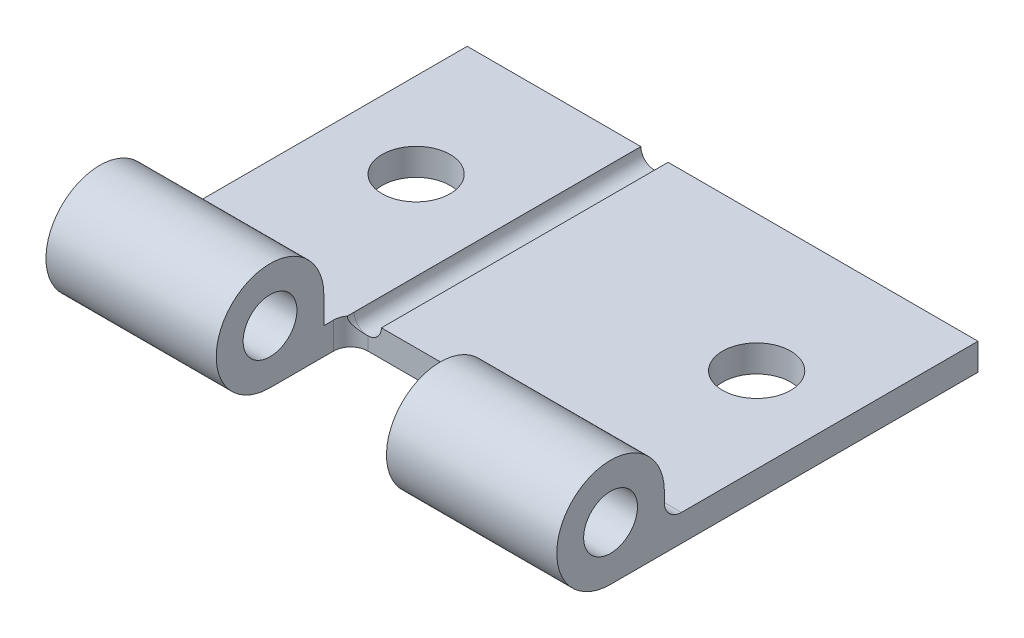
ISO-10303-21;
HEADER;
FILE_DESCRIPTION(('STEP AP214'),'2;1');
FILE_NAME('part.step','',(''),(''),'','','');
FILE_SCHEMA(('AUTOMOTIVE_DESIGN { 1 0 10303 214 1 1 1 1 }'));
ENDSEC;
DATA;
#1=APPLICATION_CONTEXT('core data for automotive mechanical design processes');
#2=APPLICATION_PROTOCOL_DEFINITION('international standard','automotive_design',2000,#1);
#3=PRODUCT_CONTEXT('',#1,'mechanical');
#4=PRODUCT('Part','Part','',(#3));
#5=PRODUCT_RELATED_PRODUCT_CATEGORY('part','',(#4));
#6=PRODUCT_DEFINITION_FORMATION('','',#4);
#7=PRODUCT_DEFINITION_CONTEXT('part definition',#1,'design');
#8=PRODUCT_DEFINITION('design','',#6,#7);
#9=PRODUCT_DEFINITION_SHAPE('','',#8);
#10=(LENGTH_UNIT() NAMED_UNIT(*) SI_UNIT(.MILLI.,.METRE.));
#11=(NAMED_UNIT(*) PLANE_ANGLE_UNIT() SI_UNIT($,.RADIAN.));
#12=(NAMED_UNIT(*) SI_UNIT($,.STERADIAN.) SOLID_ANGLE_UNIT());
#13=UNCERTAINTY_MEASURE_WITH_UNIT(LENGTH_MEASURE(1.E-05),#10,'distance_accuracy_value','');
#14=(GEOMETRIC_REPRESENTATION_CONTEXT(3) GLOBAL_UNCERTAINTY_ASSIGNED_CONTEXT((#13)) GLOBAL_UNIT_ASSIGNED_CONTEXT((#10,
#11,#12)) REPRESENTATION_CONTEXT('',''));
#15=CARTESIAN_POINT('',(0.,0.,0.));
#16=DIRECTION('',(0.,0.,1.));
#17=DIRECTION('',(1.,0.,0.));
#18=AXIS2_PLACEMENT_3D('',#15,#16,#17);
#19=CARTESIAN_POINT('',(0.,0.79,0.));
#20=DIRECTION('',(0.,-1.,0.));
#21=DIRECTION('',(0.,0.,-1.));
#22=AXIS2_PLACEMENT_3D('',#19,#20,#21);
#23=PLANE('',#22);
#24=CARTESIAN_POINT('',(9.76760563380282,0.79,-1.25352112676056));
#25=DIRECTION('',(0.,1.,0.));
#26=DIRECTION('',(0.,0.,1.));
#27=AXIS2_PLACEMENT_3D('',#24,#25,#26);
#28=CIRCLE('',#27,1.);
#29=CARTESIAN_POINT('',(9.76760563380282,0.79,-0.253521126760563));
#30=VERTEX_POINT('',#29);
#31=EDGE_CURVE('E211',#30,#30,#28,.T.);
#32=ORIENTED_EDGE('',*,*,#31,.F.);
#33=EDGE_LOOP('',(#32));
#34=FACE_BOUND('',#33,.T.);
#35=DIRECTION('',(0.,0.,1.));
#36=VECTOR('',#35,1.);
#37=CARTESIAN_POINT('',(12.2676056338028,0.79,3.16647887323944));
#38=LINE('',#37,#36);
#39=CARTESIAN_POINT('',(12.2676056338028,0.79,-5.25352112676056));
#40=VERTEX_POINT('',#39);
#41=CARTESIAN_POINT('',(12.2676056338028,0.79,3.45647887323944));
#42=VERTEX_POINT('',#41);
#43=EDGE_CURVE('E154',#40,#42,#38,.T.);
#44=ORIENTED_EDGE('',*,*,#43,.F.);
#45=DIRECTION('',(-1.,0.,0.));
#46=VECTOR('',#45,1.);
#47=CARTESIAN_POINT('',(-7.73239436619718,0.79,-5.25352112676056));
#48=LINE('',#47,#46);
#49=CARTESIAN_POINT('',(3.16760563380282,0.79,-5.25352112676056));
#50=VERTEX_POINT('',#49);
#51=EDGE_CURVE('E158',#40,#50,#48,.T.);
#52=ORIENTED_EDGE('',*,*,#51,.T.);
#53=DIRECTION('',(0.,0.,1.));
#54=VECTOR('',#53,1.);
#55=CARTESIAN_POINT('',(3.16760563380282,0.79,-6.25352112676056));
#56=LINE('',#55,#54);
#57=CARTESIAN_POINT('',(3.16760563380282,0.79,3.16647887323944));
#58=VERTEX_POINT('',#57);
#59=EDGE_CURVE('E307',#58,#50,#56,.F.);
#60=ORIENTED_EDGE('',*,*,#59,.F.);
#61=DIRECTION('',(-1.,0.,0.));
#62=VECTOR('',#61,1.);
#63=CARTESIAN_POINT('',(2.26760563380282,0.79,3.16647887323944));
#64=LINE('',#63,#62);
#65=CARTESIAN_POINT('',(6.76760563380282,0.79,3.16647887323944));
#66=VERTEX_POINT('',#65);
#67=EDGE_CURVE('E314',#66,#58,#64,.T.);
#68=ORIENTED_EDGE('',*,*,#67,.F.);
#69=CARTESIAN_POINT('',(6.76760563380282,0.79,3.66647887323944));
#70=DIRECTION('',(0.,-1.,0.));
#71=DIRECTION('',(0.,0.,-1.));
#72=AXIS2_PLACEMENT_3D('',#69,#70,#71);
#73=CIRCLE('',#72,0.5);
#74=CARTESIAN_POINT('',(7.22136768598605,0.79,3.45647887323944));
#75=VERTEX_POINT('',#74);
#76=EDGE_CURVE('E229',#66,#75,#73,.T.);
#77=ORIENTED_EDGE('',*,*,#76,.T.);
#78=DIRECTION('',(1.,0.,0.));
#79=VECTOR('',#78,1.);
#80=CARTESIAN_POINT('',(0.,0.79,3.45647887323944));
#81=LINE('',#80,#79);
#82=EDGE_CURVE('E67',#75,#42,#81,.T.);
#83=ORIENTED_EDGE('',*,*,#82,.T.);
#84=EDGE_LOOP('',(#44,#52,#60,#68,#77,#83));
#85=FACE_BOUND('',#84,.T.);
#86=ADVANCED_FACE('F38',(#34,#85),#23,.F.);
#87=CARTESIAN_POINT('',(-7.73239436619718,0.79,-5.25352112676056));
#88=DIRECTION('',(0.,0.,1.));
#89=DIRECTION('',(1.,0.,0.));
#90=AXIS2_PLACEMENT_3D('',#87,#88,#89);
#91=PLANE('',#90);
#92=DIRECTION('',(0.,1.,0.));
#93=VECTOR('',#92,1.);
#94=CARTESIAN_POINT('',(12.2676056338028,0.,-5.25352112676056));
#95=LINE('',#94,#93);
#96=CARTESIAN_POINT('',(12.2676056338028,0.,-5.25352112676056));
#97=VERTEX_POINT('',#96);
#98=EDGE_CURVE('E166',#97,#40,#95,.T.);
#99=ORIENTED_EDGE('',*,*,#98,.F.);
#100=DIRECTION('',(-1.,0.,0.));
#101=VECTOR('',#100,1.);
#102=CARTESIAN_POINT('',(-7.73239436619718,0.,-5.25352112676056));
#103=LINE('',#102,#101);
#104=CARTESIAN_POINT('',(-2.73239436619718,0.,-5.25352112676056));
#105=VERTEX_POINT('',#104);
#106=EDGE_CURVE('E188',#97,#105,#103,.T.);
#107=ORIENTED_EDGE('',*,*,#106,.T.);
#108=DIRECTION('',(0.,-1.,0.));
#109=VECTOR('',#108,1.);
#110=CARTESIAN_POINT('',(-2.73239436619718,0.,-5.25352112676056));
#111=LINE('',#110,#109);
#112=CARTESIAN_POINT('',(-2.73239436619718,0.79,-5.25352112676056));
#113=VERTEX_POINT('',#112);
#114=EDGE_CURVE('E174',#113,#105,#111,.T.);
#115=ORIENTED_EDGE('',*,*,#114,.F.);
#116=CARTESIAN_POINT('',(2.36760563380282,0.79,-5.25352112676056));
#117=VERTEX_POINT('',#116);
#118=EDGE_CURVE('E181',#117,#113,#48,.T.);
#119=ORIENTED_EDGE('',*,*,#118,.F.);
#120=CARTESIAN_POINT('',(2.76760563380282,0.79,-5.25352112676056));
#121=DIRECTION('',(0.,0.,1.));
#122=DIRECTION('',(1.,0.,0.));
#123=AXIS2_PLACEMENT_3D('',#120,#121,#122);
#124=CIRCLE('',#123,0.4);
#125=EDGE_CURVE('E179',#117,#50,#124,.T.);
#126=ORIENTED_EDGE('',*,*,#125,.T.);
#127=ORIENTED_EDGE('',*,*,#51,.F.);
#128=EDGE_LOOP('',(#99,#107,#115,#119,#126,#127));
#129=FACE_BOUND('',#128,.T.);
#130=ADVANCED_FACE('F177',(#129),#91,.F.);
#131=CARTESIAN_POINT('',(0.,0.,0.));
#132=DIRECTION('',(0.,-1.,0.));
#133=DIRECTION('',(0.,0.,-1.));
#134=AXIS2_PLACEMENT_3D('',#131,#132,#133);
#135=PLANE('',#134);
#136=CARTESIAN_POINT('',(-0.232394366197182,0.,-1.25352112676056));
#137=DIRECTION('',(0.,-1.,0.));
#138=DIRECTION('',(0.,0.,-1.));
#139=AXIS2_PLACEMENT_3D('',#136,#137,#138);
#140=CIRCLE('',#139,1.);
#141=CARTESIAN_POINT('',(-0.232394366197182,0.,-2.25352112676057));
#142=VERTEX_POINT('',#141);
#143=EDGE_CURVE('E212',#142,#142,#140,.F.);
#144=ORIENTED_EDGE('',*,*,#143,.T.);
#145=EDGE_LOOP('',(#144));
#146=FACE_BOUND('',#145,.T.);
#147=CARTESIAN_POINT('',(9.76760563380282,0.,-1.25352112676056));
#148=DIRECTION('',(0.,-1.,0.));
#149=DIRECTION('',(0.,0.,-1.));
#150=AXIS2_PLACEMENT_3D('',#147,#148,#149);
#151=CIRCLE('',#150,1.);
#152=CARTESIAN_POINT('',(9.76760563380282,0.,-2.25352112676057));
#153=VERTEX_POINT('',#152);
#154=EDGE_CURVE('E206',#153,#153,#151,.T.);
#155=ORIENTED_EDGE('',*,*,#154,.F.);
#156=EDGE_LOOP('',(#155));
#157=FACE_BOUND('',#156,.T.);
#158=ORIENTED_EDGE('',*,*,#106,.F.);
#159=DIRECTION('',(0.,0.,-1.));
#160=VECTOR('',#159,1.);
#161=CARTESIAN_POINT('',(12.2676056338028,0.,5.53647887323944));
#162=LINE('',#161,#160);
#163=CARTESIAN_POINT('',(12.2676056338028,0.,5.53647887323944));
#164=VERTEX_POINT('',#163);
#165=EDGE_CURVE('E170',#164,#97,#162,.T.);
#166=ORIENTED_EDGE('',*,*,#165,.F.);
#167=DIRECTION('',(1.,0.,0.));
#168=VECTOR('',#167,1.);
#169=CARTESIAN_POINT('',(7.26760563380282,0.,5.53647887323944));
#170=LINE('',#169,#168);
#171=CARTESIAN_POINT('',(7.26760563380282,0.,5.53647887323944));
#172=VERTEX_POINT('',#171);
#173=EDGE_CURVE('E191',#172,#164,#170,.T.);
#174=ORIENTED_EDGE('',*,*,#173,.F.);
#175=DIRECTION('',(0.,0.,-1.));
#176=VECTOR('',#175,1.);
#177=CARTESIAN_POINT('',(7.26760563380282,0.,5.53647887323944));
#178=LINE('',#177,#176);
#179=CARTESIAN_POINT('',(7.26760563380282,0.,3.66647887323944));
#180=VERTEX_POINT('',#179);
#181=EDGE_CURVE('E378',#172,#180,#178,.T.);
#182=ORIENTED_EDGE('',*,*,#181,.T.);
#183=CARTESIAN_POINT('',(6.76760563380282,0.,3.66647887323944));
#184=DIRECTION('',(0.,-1.,0.));
#185=DIRECTION('',(0.,0.,-1.));
#186=AXIS2_PLACEMENT_3D('',#183,#184,#185);
#187=CIRCLE('',#186,0.5);
#188=CARTESIAN_POINT('',(6.76760563380282,0.,3.16647887323944));
#189=VERTEX_POINT('',#188);
#190=EDGE_CURVE('E240',#180,#189,#187,.F.);
#191=ORIENTED_EDGE('',*,*,#190,.T.);
#192=DIRECTION('',(1.,0.,0.));
#193=VECTOR('',#192,1.);
#194=CARTESIAN_POINT('',(2.26760563380282,0.,3.16647887323944));
#195=LINE('',#194,#193);
#196=CARTESIAN_POINT('',(2.76760563380282,0.,3.16647887323944));
#197=VERTEX_POINT('',#196);
#198=EDGE_CURVE('E310',#197,#189,#195,.T.);
#199=ORIENTED_EDGE('',*,*,#198,.F.);
#200=CARTESIAN_POINT('',(2.76760563380282,0.,3.66647887323944));
#201=DIRECTION('',(0.,-1.,0.));
#202=DIRECTION('',(0.,0.,-1.));
#203=AXIS2_PLACEMENT_3D('',#200,#201,#202);
#204=CIRCLE('',#203,0.5);
#205=CARTESIAN_POINT('',(2.26760563380282,0.,3.66647887323944));
#206=VERTEX_POINT('',#205);
#207=EDGE_CURVE('E413',#197,#206,#204,.F.);
#208=ORIENTED_EDGE('',*,*,#207,.T.);
#209=DIRECTION('',(0.,0.,-1.));
#210=VECTOR('',#209,1.);
#211=CARTESIAN_POINT('',(2.26760563380282,0.,5.53647887323944));
#212=LINE('',#211,#210);
#213=CARTESIAN_POINT('',(2.26760563380282,0.,5.53647887323944));
#214=VERTEX_POINT('',#213);
#215=EDGE_CURVE('E340',#214,#206,#212,.T.);
#216=ORIENTED_EDGE('',*,*,#215,.F.);
#217=DIRECTION('',(-1.,0.,0.));
#218=VECTOR('',#217,1.);
#219=CARTESIAN_POINT('',(2.26760563380282,0.,5.53647887323944));
#220=LINE('',#219,#218);
#221=CARTESIAN_POINT('',(-2.73239436619718,0.,5.53647887323944));
#222=VERTEX_POINT('',#221);
#223=EDGE_CURVE('E353',#214,#222,#220,.T.);
#224=ORIENTED_EDGE('',*,*,#223,.T.);
#225=DIRECTION('',(0.,0.,-1.));
#226=VECTOR('',#225,1.);
#227=CARTESIAN_POINT('',(-2.73239436619718,0.,5.53647887323944));
#228=LINE('',#227,#226);
#229=EDGE_CURVE('E337',#222,#105,#228,.T.);
#230=ORIENTED_EDGE('',*,*,#229,.T.);
#231=EDGE_LOOP('',(#158,#166,#174,#182,#191,#199,#208,#216,#224,#230));
#232=FACE_BOUND('',#231,.T.);
#233=ADVANCED_FACE('F269',(#146,#157,#232),#135,.T.);
#234=CARTESIAN_POINT('',(-0.232394366197182,0.79,-1.25352112676056));
#235=DIRECTION('',(0.,-1.,0.));
#236=DIRECTION('',(0.,0.,1.));
#237=AXIS2_PLACEMENT_3D('',#234,#235,#236);
#238=CIRCLE('',#237,1.);
#239=CARTESIAN_POINT('',(-0.232394366197182,0.79,-0.253521126760563));
#240=VERTEX_POINT('',#239);
#241=EDGE_CURVE('E162',#240,#240,#238,.T.);
#242=ORIENTED_EDGE('',*,*,#241,.T.);
#243=EDGE_LOOP('',(#242));
#244=FACE_BOUND('',#243,.T.);
#245=ORIENTED_EDGE('',*,*,#118,.T.);
#246=DIRECTION('',(0.,0.,1.));
#247=VECTOR('',#246,1.);
#248=CARTESIAN_POINT('',(-2.73239436619718,0.79,3.16647887323944));
#249=LINE('',#248,#247);
#250=CARTESIAN_POINT('',(-2.73239436619718,0.79,3.95647887323944));
#251=VERTEX_POINT('',#250);
#252=EDGE_CURVE('E287',#113,#251,#249,.T.);
#253=ORIENTED_EDGE('',*,*,#252,.T.);
#254=DIRECTION('',(-1.,0.,0.));
#255=VECTOR('',#254,1.);
#256=CARTESIAN_POINT('',(2.26760563380282,0.79,3.95647887323944));
#257=LINE('',#256,#255);
#258=CARTESIAN_POINT('',(2.26760563380282,0.79,3.95647887323944));
#259=VERTEX_POINT('',#258);
#260=EDGE_CURVE('E357',#259,#251,#257,.T.);
#261=ORIENTED_EDGE('',*,*,#260,.F.);
#262=DIRECTION('',(0.,0.,1.));
#263=VECTOR('',#262,1.);
#264=CARTESIAN_POINT('',(2.26760563380282,0.79,3.16647887323944));
#265=LINE('',#264,#263);
#266=CARTESIAN_POINT('',(2.26760563380282,0.79,3.66647887323944));
#267=VERTEX_POINT('',#266);
#268=EDGE_CURVE('E163',#267,#259,#265,.T.);
#269=ORIENTED_EDGE('',*,*,#268,.F.);
#270=CARTESIAN_POINT('',(2.76760563380282,0.79,3.66647887323944));
#271=DIRECTION('',(0.,-1.,0.));
#272=DIRECTION('',(0.,0.,-1.));
#273=AXIS2_PLACEMENT_3D('',#270,#271,#272);
#274=CIRCLE('',#273,0.5);
#275=CARTESIAN_POINT('',(2.36760563380282,0.79,3.36647887323944));
#276=VERTEX_POINT('',#275);
#277=EDGE_CURVE('E53',#267,#276,#274,.T.);
#278=ORIENTED_EDGE('',*,*,#277,.T.);
#279=DIRECTION('',(0.,0.,1.));
#280=VECTOR('',#279,1.);
#281=CARTESIAN_POINT('',(2.36760563380282,0.79,3.16647887323944));
#282=LINE('',#281,#280);
#283=CARTESIAN_POINT('',(2.36760563380282,0.79,3.16647887323944));
#284=VERTEX_POINT('',#283);
#285=EDGE_CURVE('E59',#284,#276,#282,.T.);
#286=ORIENTED_EDGE('',*,*,#285,.F.);
#287=DIRECTION('',(0.,0.,1.));
#288=VECTOR('',#287,1.);
#289=CARTESIAN_POINT('',(2.36760563380282,0.79,-6.25352112676056));
#290=LINE('',#289,#288);
#291=EDGE_CURVE('E289',#117,#284,#290,.T.);
#292=ORIENTED_EDGE('',*,*,#291,.F.);
#293=EDGE_LOOP('',(#245,#253,#261,#269,#278,#286,#292));
#294=FACE_BOUND('',#293,.T.);
#295=ADVANCED_FACE('F265',(#244,#294),#23,.F.);
#296=CARTESIAN_POINT('',(2.76760563380282,0.,3.66647887323944));
#297=DIRECTION('',(0.,-1.,0.));
#298=DIRECTION('',(0.,0.,-1.));
#299=AXIS2_PLACEMENT_3D('',#296,#297,#298);
#300=CYLINDRICAL_SURFACE('',#299,0.5);
#301=CARTESIAN_POINT('',(2.36760563380282,0.79,3.36647887323944));
#302=CARTESIAN_POINT('',(2.36758867376798,0.77479492406649,3.36653060088669));
#303=CARTESIAN_POINT('',(2.36847103051959,0.759669221021409,3.36532247769685));
#304=CARTESIAN_POINT('',(2.37184467580235,0.730102203649893,3.36088908238327));
#305=CARTESIAN_POINT('',(2.37431387131641,0.715654371218834,3.3576915276317));
#306=CARTESIAN_POINT('',(2.38181696433993,0.682516943590168,3.34834083793961));
#307=CARTESIAN_POINT('',(2.3874518223896,0.664154843723536,3.34154003702006));
#308=CARTESIAN_POINT('',(2.40099684370557,0.628885854292834,3.32632701268709));
#309=CARTESIAN_POINT('',(2.40892368136178,0.611990853685963,3.31790313675109));
#310=CARTESIAN_POINT('',(2.43005648966823,0.57391945575228,3.29722314191729));
#311=CARTESIAN_POINT('',(2.44413600695534,0.553384305196083,3.28467715792683));
#312=CARTESIAN_POINT('',(2.47590091343324,0.51518580712662,3.25988949375957));
#313=CARTESIAN_POINT('',(2.49357938445238,0.497517064961277,3.24764727956154));
#314=CARTESIAN_POINT('',(2.52865018700535,0.468581679334928,3.22689948698771));
#315=CARTESIAN_POINT('',(2.54541156115519,0.456739633312899,3.21813310203662));
#316=CARTESIAN_POINT('',(2.58110879966452,0.435530953263857,3.20215178619807));
#317=CARTESIAN_POINT('',(2.600042159532,0.426161508463358,3.19493509542262));
#318=CARTESIAN_POINT('',(2.63655437489482,0.41165191304855,3.18364318602813));
#319=CARTESIAN_POINT('',(2.65385945096987,0.40607343531193,3.17924906803056));
#320=CARTESIAN_POINT('',(2.68939784072297,0.397296870651093,3.17230474337093));
#321=CARTESIAN_POINT('',(2.70762915889703,0.394093880453058,3.16975073882041));
#322=CARTESIAN_POINT('',(2.73983603061864,0.390720478752094,3.1670547239495));
#323=CARTESIAN_POINT('',(2.75371876506601,0.389987120164164,3.16646538351416));
#324=CARTESIAN_POINT('',(2.76760563380282,0.389999999999999,3.16647887323944));
#325=B_SPLINE_CURVE_WITH_KNOTS('',3,(#301,#302,#303,#304,#305,#306,#307,#308,#309,#310,#311,
#312,#313,#314,#315,#316,#317,#318,#319,#320,#321,#322,#323,#324),.UNSPECIFIED.,.F.,.F.,(4,2,2,
2,2,2,2,2,2,2,2,4),(0.,0.0454149257539957,0.0902108639957983,0.151002217611107,
0.212247468733034,0.295486190035688,0.378566389550927,0.445264335078953,0.511886130705307,
0.567766615766531,0.623531433721996,0.665159088747445),.UNSPECIFIED.);
#326=CARTESIAN_POINT('',(2.76760563380282,0.39,3.16647887323944));
#327=VERTEX_POINT('',#326);
#328=EDGE_CURVE('E11',#276,#327,#325,.T.);
#329=ORIENTED_EDGE('',*,*,#328,.F.);
#330=ORIENTED_EDGE('',*,*,#277,.F.);
#331=DIRECTION('',(0.,-1.,0.));
#332=VECTOR('',#331,1.);
#333=CARTESIAN_POINT('',(2.26760563380282,1.58,3.66647887323944));
#334=LINE('',#333,#332);
#335=EDGE_CURVE('E226',#206,#267,#334,.F.);
#336=ORIENTED_EDGE('',*,*,#335,.F.);
#337=ORIENTED_EDGE('',*,*,#207,.F.);
#338=DIRECTION('',(0.,-1.,0.));
#339=VECTOR('',#338,1.);
#340=CARTESIAN_POINT('',(2.76760563380282,0.,3.16647887323944));
#341=LINE('',#340,#339);
#342=EDGE_CURVE('E205',#327,#197,#341,.T.);
#343=ORIENTED_EDGE('',*,*,#342,.F.);
#344=EDGE_LOOP('',(#329,#330,#336,#337,#343));
#345=FACE_BOUND('',#344,.T.);
#346=ADVANCED_FACE('F40',(#345),#300,.F.);
#347=CARTESIAN_POINT('',(7.26760563380282,1.58,5.53647887323944));
#348=DIRECTION('',(1.,0.,0.));
#349=DIRECTION('',(0.,0.,-1.));
#350=AXIS2_PLACEMENT_3D('',#347,#348,#349);
#351=PLANE('',#350);
#352=CARTESIAN_POINT('',(7.26760563380282,1.58,5.53647887323944));
#353=DIRECTION('',(1.,0.,0.));
#354=DIRECTION('',(0.,0.,-1.));
#355=AXIS2_PLACEMENT_3D('',#352,#353,#354);
#356=CIRCLE('',#355,0.79);
#357=CARTESIAN_POINT('',(7.26760563380282,1.58,4.74647887323944));
#358=VERTEX_POINT('',#357);
#359=EDGE_CURVE('E366',#358,#358,#356,.T.);
#360=ORIENTED_EDGE('',*,*,#359,.T.);
#361=EDGE_LOOP('',(#360));
#362=FACE_BOUND('',#361,.T.);
#363=CARTESIAN_POINT('',(7.26760563380282,1.29,3.45647887323944));
#364=DIRECTION('',(1.,0.,0.));
#365=DIRECTION('',(0.,0.,-1.));
#366=AXIS2_PLACEMENT_3D('',#363,#364,#365);
#367=CIRCLE('',#366,0.5);
#368=CARTESIAN_POINT('',(7.26760563380282,1.29,3.95647887323944));
#369=VERTEX_POINT('',#368);
#370=CARTESIAN_POINT('',(7.26760563380282,0.836237947818463,3.66647887323944));
#371=VERTEX_POINT('',#370);
#372=EDGE_CURVE('E201',#369,#371,#367,.T.);
#373=ORIENTED_EDGE('',*,*,#372,.T.);
#374=DIRECTION('',(0.,1.,0.));
#375=VECTOR('',#374,1.);
#376=CARTESIAN_POINT('',(7.26760563380282,1.58,3.66647887323944));
#377=LINE('',#376,#375);
#378=EDGE_CURVE('E223',#371,#180,#377,.F.);
#379=ORIENTED_EDGE('',*,*,#378,.T.);
#380=ORIENTED_EDGE('',*,*,#181,.F.);
#381=CARTESIAN_POINT('',(7.26760563380282,1.58,5.53647887323944));
#382=DIRECTION('',(1.,0.,0.));
#383=DIRECTION('',(0.,0.,-1.));
#384=AXIS2_PLACEMENT_3D('',#381,#382,#383);
#385=CIRCLE('',#384,1.58);
#386=CARTESIAN_POINT('',(7.26760563380282,1.58,3.95647887323944));
#387=VERTEX_POINT('',#386);
#388=EDGE_CURVE('E374',#387,#172,#385,.T.);
#389=ORIENTED_EDGE('',*,*,#388,.F.);
#390=DIRECTION('',(0.,1.,0.));
#391=VECTOR('',#390,1.);
#392=CARTESIAN_POINT('',(7.26760563380282,1.58,3.95647887323944));
#393=LINE('',#392,#391);
#394=EDGE_CURVE('E383',#369,#387,#393,.T.);
#395=ORIENTED_EDGE('',*,*,#394,.F.);
#396=EDGE_LOOP('',(#373,#379,#380,#389,#395));
#397=FACE_BOUND('',#396,.T.);
#398=ADVANCED_FACE('F279',(#362,#397),#351,.F.);
#399=CARTESIAN_POINT('',(12.2676056338028,1.58,5.53647887323944));
#400=DIRECTION('',(1.,0.,0.));
#401=DIRECTION('',(0.,0.,-1.));
#402=AXIS2_PLACEMENT_3D('',#399,#400,#401);
#403=PLANE('',#402);
#404=CARTESIAN_POINT('',(12.2676056338028,1.58,5.53647887323944));
#405=DIRECTION('',(1.,0.,0.));
#406=DIRECTION('',(0.,0.,-1.));
#407=AXIS2_PLACEMENT_3D('',#404,#405,#406);
#408=CIRCLE('',#407,0.79);
#409=CARTESIAN_POINT('',(12.2676056338028,1.58,4.74647887323944));
#410=VERTEX_POINT('',#409);
#411=EDGE_CURVE('E210',#410,#410,#408,.T.);
#412=ORIENTED_EDGE('',*,*,#411,.F.);
#413=EDGE_LOOP('',(#412));
#414=FACE_BOUND('',#413,.T.);
#415=ORIENTED_EDGE('',*,*,#165,.T.);
#416=ORIENTED_EDGE('',*,*,#98,.T.);
#417=ORIENTED_EDGE('',*,*,#43,.T.);
#418=CARTESIAN_POINT('',(12.2676056338028,1.29,3.45647887323944));
#419=DIRECTION('',(1.,0.,0.));
#420=DIRECTION('',(0.,0.,-1.));
#421=AXIS2_PLACEMENT_3D('',#418,#419,#420);
#422=CIRCLE('',#421,0.5);
#423=CARTESIAN_POINT('',(12.2676056338028,1.29,3.95647887323944));
#424=VERTEX_POINT('',#423);
#425=EDGE_CURVE('E198',#42,#424,#422,.F.);
#426=ORIENTED_EDGE('',*,*,#425,.T.);
#427=DIRECTION('',(0.,1.,0.));
#428=VECTOR('',#427,1.);
#429=CARTESIAN_POINT('',(12.2676056338028,1.58,3.95647887323944));
#430=LINE('',#429,#428);
#431=CARTESIAN_POINT('',(12.2676056338028,1.58,3.95647887323944));
#432=VERTEX_POINT('',#431);
#433=EDGE_CURVE('E379',#424,#432,#430,.T.);
#434=ORIENTED_EDGE('',*,*,#433,.T.);
#435=CARTESIAN_POINT('',(12.2676056338028,1.58,5.53647887323944));
#436=DIRECTION('',(1.,0.,0.));
#437=DIRECTION('',(0.,0.,-1.));
#438=AXIS2_PLACEMENT_3D('',#435,#436,#437);
#439=CIRCLE('',#438,1.58);
#440=EDGE_CURVE('E370',#432,#164,#439,.T.);
#441=ORIENTED_EDGE('',*,*,#440,.T.);
#442=EDGE_LOOP('',(#415,#416,#417,#426,#434,#441));
#443=FACE_BOUND('',#442,.T.);
#444=ADVANCED_FACE('F167',(#414,#443),#403,.T.);
#445=CARTESIAN_POINT('',(7.26760563380282,1.58,5.53647887323944));
#446=DIRECTION('',(1.,0.,0.));
#447=DIRECTION('',(0.,0.,-1.));
#448=AXIS2_PLACEMENT_3D('',#445,#446,#447);
#449=CYLINDRICAL_SURFACE('',#448,1.58);
#450=ORIENTED_EDGE('',*,*,#440,.F.);
#451=DIRECTION('',(1.,0.,0.));
#452=VECTOR('',#451,1.);
#453=CARTESIAN_POINT('',(7.26760563380282,1.58,3.95647887323944));
#454=LINE('',#453,#452);
#455=EDGE_CURVE('E194',#387,#432,#454,.T.);
#456=ORIENTED_EDGE('',*,*,#455,.F.);
#457=ORIENTED_EDGE('',*,*,#388,.T.);
#458=ORIENTED_EDGE('',*,*,#173,.T.);
#459=EDGE_LOOP('',(#450,#456,#457,#458));
#460=FACE_BOUND('',#459,.T.);
#461=ADVANCED_FACE('F399',(#460),#449,.T.);
#462=CARTESIAN_POINT('',(7.26760563380282,1.58,3.95647887323944));
#463=DIRECTION('',(0.,0.,-1.));
#464=DIRECTION('',(-1.,0.,0.));
#465=AXIS2_PLACEMENT_3D('',#462,#463,#464);
#466=PLANE('',#465);
#467=ORIENTED_EDGE('',*,*,#433,.F.);
#468=DIRECTION('',(1.,0.,0.));
#469=VECTOR('',#468,1.);
#470=CARTESIAN_POINT('',(7.26760563380282,1.29,3.95647887323944));
#471=LINE('',#470,#469);
#472=EDGE_CURVE('E185',#424,#369,#471,.F.);
#473=ORIENTED_EDGE('',*,*,#472,.T.);
#474=ORIENTED_EDGE('',*,*,#394,.T.);
#475=ORIENTED_EDGE('',*,*,#455,.T.);
#476=EDGE_LOOP('',(#467,#473,#474,#475));
#477=FACE_BOUND('',#476,.T.);
#478=ADVANCED_FACE('F404',(#477),#466,.T.);
#479=CARTESIAN_POINT('',(7.26760563380282,1.58,5.53647887323944));
#480=DIRECTION('',(1.,0.,0.));
#481=DIRECTION('',(0.,0.,-1.));
#482=AXIS2_PLACEMENT_3D('',#479,#480,#481);
#483=CYLINDRICAL_SURFACE('',#482,0.79);
#484=ORIENTED_EDGE('',*,*,#359,.F.);
#485=EDGE_LOOP('',(#484));
#486=FACE_BOUND('',#485,.T.);
#487=ORIENTED_EDGE('',*,*,#411,.T.);
#488=EDGE_LOOP('',(#487));
#489=FACE_BOUND('',#488,.T.);
#490=ADVANCED_FACE('F457',(#486,#489),#483,.F.);
#491=CARTESIAN_POINT('',(0.,1.29,3.45647887323944));
#492=DIRECTION('',(1.,0.,0.));
#493=DIRECTION('',(0.,0.,-1.));
#494=AXIS2_PLACEMENT_3D('',#491,#492,#493);
#495=CYLINDRICAL_SURFACE('',#494,0.5);
#496=ORIENTED_EDGE('',*,*,#372,.F.);
#497=ORIENTED_EDGE('',*,*,#472,.F.);
#498=ORIENTED_EDGE('',*,*,#425,.F.);
#499=ORIENTED_EDGE('',*,*,#82,.F.);
#500=CARTESIAN_POINT('',(7.22136768598605,0.79,3.45647887323944));
#501=CARTESIAN_POINT('',(7.23024361540518,0.789964615548071,3.475568987507));
#502=CARTESIAN_POINT('',(7.23785469074132,0.791092691123601,3.49526588725395));
#503=CARTESIAN_POINT('',(7.25034128008673,0.795772712002054,3.53467216465767));
#504=CARTESIAN_POINT('',(7.25528122856074,0.799262509418902,3.55436857734897));
#505=CARTESIAN_POINT('',(7.26190691173974,0.807764758461069,3.58954546237819));
#506=CARTESIAN_POINT('',(7.26405477407484,0.812312051019511,3.60505408470595));
#507=CARTESIAN_POINT('',(7.26692395086886,0.823041570204148,3.63599423615678));
#508=CARTESIAN_POINT('',(7.26761499537757,0.829255519642446,3.65141760933972));
#509=CARTESIAN_POINT('',(7.26760563380282,0.836237947818463,3.66647887323944));
#510=B_SPLINE_CURVE_WITH_KNOTS('',3,(#500,#501,#502,#503,#504,#505,#506,#507,#508,#509),
.UNSPECIFIED.,.F.,.F.,(4,2,2,2,4),(0.,0.0631113819484053,0.124623453502766,0.173393504101389,
0.223167303411871),.UNSPECIFIED.);
#511=EDGE_CURVE('E232',#75,#371,#510,.T.);
#512=ORIENTED_EDGE('',*,*,#511,.T.);
#513=EDGE_LOOP('',(#496,#497,#498,#499,#512));
#514=FACE_BOUND('',#513,.T.);
#515=ADVANCED_FACE('F242',(#514),#495,.F.);
#516=CARTESIAN_POINT('',(9.76760563380282,-4.21,-1.25352112676056));
#517=DIRECTION('',(0.,1.,0.));
#518=DIRECTION('',(0.,0.,1.));
#519=AXIS2_PLACEMENT_3D('',#516,#517,#518);
#520=CYLINDRICAL_SURFACE('',#519,1.);
#521=ORIENTED_EDGE('',*,*,#154,.T.);
#522=EDGE_LOOP('',(#521));
#523=FACE_BOUND('',#522,.T.);
#524=ORIENTED_EDGE('',*,*,#31,.T.);
#525=EDGE_LOOP('',(#524));
#526=FACE_BOUND('',#525,.T.);
#527=ADVANCED_FACE('F443',(#523,#526),#520,.F.);
#528=CARTESIAN_POINT('',(2.26760563380282,1.58,5.53647887323944));
#529=DIRECTION('',(-1.,0.,0.));
#530=DIRECTION('',(0.,0.,-1.));
#531=AXIS2_PLACEMENT_3D('',#528,#529,#530);
#532=PLANE('',#531);
#533=ORIENTED_EDGE('',*,*,#215,.T.);
#534=ORIENTED_EDGE('',*,*,#335,.T.);
#535=ORIENTED_EDGE('',*,*,#268,.T.);
#536=DIRECTION('',(0.,1.,0.));
#537=VECTOR('',#536,1.);
#538=CARTESIAN_POINT('',(2.26760563380282,1.58,3.95647887323944));
#539=LINE('',#538,#537);
#540=CARTESIAN_POINT('',(2.26760563380282,1.58,3.95647887323944));
#541=VERTEX_POINT('',#540);
#542=EDGE_CURVE('E336',#259,#541,#539,.T.);
#543=ORIENTED_EDGE('',*,*,#542,.T.);
#544=CARTESIAN_POINT('',(2.26760563380282,1.58,5.53647887323944));
#545=DIRECTION('',(1.,0.,0.));
#546=DIRECTION('',(0.,0.,-1.));
#547=AXIS2_PLACEMENT_3D('',#544,#545,#546);
#548=CIRCLE('',#547,1.58);
#549=EDGE_CURVE('E332',#541,#214,#548,.T.);
#550=ORIENTED_EDGE('',*,*,#549,.T.);
#551=EDGE_LOOP('',(#533,#534,#535,#543,#550));
#552=FACE_BOUND('',#551,.T.);
#553=CARTESIAN_POINT('',(2.26760563380282,1.58,5.53647887323944));
#554=DIRECTION('',(1.,0.,0.));
#555=DIRECTION('',(0.,0.,-1.));
#556=AXIS2_PLACEMENT_3D('',#553,#554,#555);
#557=CIRCLE('',#556,0.79);
#558=CARTESIAN_POINT('',(2.26760563380282,1.58,4.74647887323944));
#559=VERTEX_POINT('',#558);
#560=EDGE_CURVE('E324',#559,#559,#557,.T.);
#561=ORIENTED_EDGE('',*,*,#560,.F.);
#562=EDGE_LOOP('',(#561));
#563=FACE_BOUND('',#562,.T.);
#564=ADVANCED_FACE('F439',(#552,#563),#532,.F.);
#565=CARTESIAN_POINT('',(-2.73239436619718,1.58,5.53647887323944));
#566=DIRECTION('',(-1.,0.,0.));
#567=DIRECTION('',(0.,0.,-1.));
#568=AXIS2_PLACEMENT_3D('',#565,#566,#567);
#569=PLANE('',#568);
#570=DIRECTION('',(0.,1.,0.));
#571=VECTOR('',#570,1.);
#572=CARTESIAN_POINT('',(-2.73239436619718,1.58,3.95647887323944));
#573=LINE('',#572,#571);
#574=CARTESIAN_POINT('',(-2.73239436619718,1.58,3.95647887323944));
#575=VERTEX_POINT('',#574);
#576=EDGE_CURVE('E348',#251,#575,#573,.T.);
#577=ORIENTED_EDGE('',*,*,#576,.F.);
#578=ORIENTED_EDGE('',*,*,#252,.F.);
#579=ORIENTED_EDGE('',*,*,#114,.T.);
#580=ORIENTED_EDGE('',*,*,#229,.F.);
#581=CARTESIAN_POINT('',(-2.73239436619718,1.58,5.53647887323944));
#582=DIRECTION('',(1.,0.,0.));
#583=DIRECTION('',(0.,0.,-1.));
#584=AXIS2_PLACEMENT_3D('',#581,#582,#583);
#585=CIRCLE('',#584,1.58);
#586=EDGE_CURVE('E328',#575,#222,#585,.T.);
#587=ORIENTED_EDGE('',*,*,#586,.F.);
#588=EDGE_LOOP('',(#577,#578,#579,#580,#587));
#589=FACE_BOUND('',#588,.T.);
#590=CARTESIAN_POINT('',(-2.73239436619718,1.58,5.53647887323944));
#591=DIRECTION('',(1.,0.,0.));
#592=DIRECTION('',(0.,0.,-1.));
#593=AXIS2_PLACEMENT_3D('',#590,#591,#592);
#594=CIRCLE('',#593,0.79);
#595=CARTESIAN_POINT('',(-2.73239436619718,1.58,4.74647887323944));
#596=VERTEX_POINT('',#595);
#597=EDGE_CURVE('E216',#596,#596,#594,.T.);
#598=ORIENTED_EDGE('',*,*,#597,.T.);
#599=EDGE_LOOP('',(#598));
#600=FACE_BOUND('',#599,.T.);
#601=ADVANCED_FACE('F442',(#589,#600),#569,.T.);
#602=CARTESIAN_POINT('',(2.26760563380282,1.58,5.53647887323944));
#603=DIRECTION('',(-1.,0.,0.));
#604=DIRECTION('',(0.,0.,1.));
#605=AXIS2_PLACEMENT_3D('',#602,#603,#604);
#606=CYLINDRICAL_SURFACE('',#605,1.58);
#607=ORIENTED_EDGE('',*,*,#586,.T.);
#608=ORIENTED_EDGE('',*,*,#223,.F.);
#609=ORIENTED_EDGE('',*,*,#549,.F.);
#610=DIRECTION('',(-1.,0.,0.));
#611=VECTOR('',#610,1.);
#612=CARTESIAN_POINT('',(2.26760563380282,1.58,3.95647887323944));
#613=LINE('',#612,#611);
#614=EDGE_CURVE('E344',#541,#575,#613,.T.);
#615=ORIENTED_EDGE('',*,*,#614,.T.);
#616=EDGE_LOOP('',(#607,#608,#609,#615));
#617=FACE_BOUND('',#616,.T.);
#618=ADVANCED_FACE('F447',(#617),#606,.T.);
#619=CARTESIAN_POINT('',(2.26760563380282,1.58,3.95647887323944));
#620=DIRECTION('',(0.,0.,1.));
#621=DIRECTION('',(1.,0.,0.));
#622=AXIS2_PLACEMENT_3D('',#619,#620,#621);
#623=PLANE('',#622);
#624=ORIENTED_EDGE('',*,*,#576,.T.);
#625=ORIENTED_EDGE('',*,*,#614,.F.);
#626=ORIENTED_EDGE('',*,*,#542,.F.);
#627=ORIENTED_EDGE('',*,*,#260,.T.);
#628=EDGE_LOOP('',(#624,#625,#626,#627));
#629=FACE_BOUND('',#628,.T.);
#630=ADVANCED_FACE('F437',(#629),#623,.F.);
#631=CARTESIAN_POINT('',(2.26760563380282,1.58,5.53647887323944));
#632=DIRECTION('',(-1.,0.,0.));
#633=DIRECTION('',(0.,0.,1.));
#634=AXIS2_PLACEMENT_3D('',#631,#632,#633);
#635=CYLINDRICAL_SURFACE('',#634,0.79);
#636=ORIENTED_EDGE('',*,*,#560,.T.);
#637=EDGE_LOOP('',(#636));
#638=FACE_BOUND('',#637,.T.);
#639=ORIENTED_EDGE('',*,*,#597,.F.);
#640=EDGE_LOOP('',(#639));
#641=FACE_BOUND('',#640,.T.);
#642=ADVANCED_FACE('F433',(#638,#641),#635,.F.);
#643=CARTESIAN_POINT('',(-0.232394366197182,-4.21,-1.25352112676056));
#644=DIRECTION('',(0.,1.,0.));
#645=DIRECTION('',(0.,0.,1.));
#646=AXIS2_PLACEMENT_3D('',#643,#644,#645);
#647=CYLINDRICAL_SURFACE('',#646,1.);
#648=ORIENTED_EDGE('',*,*,#143,.F.);
#649=EDGE_LOOP('',(#648));
#650=FACE_BOUND('',#649,.T.);
#651=ORIENTED_EDGE('',*,*,#241,.F.);
#652=EDGE_LOOP('',(#651));
#653=FACE_BOUND('',#652,.T.);
#654=ADVANCED_FACE('F258',(#650,#653),#647,.F.);
#655=CARTESIAN_POINT('',(0.,0.,3.16647887323944));
#656=DIRECTION('',(0.,0.,1.));
#657=DIRECTION('',(1.,0.,0.));
#658=AXIS2_PLACEMENT_3D('',#655,#656,#657);
#659=PLANE('',#658);
#660=ORIENTED_EDGE('',*,*,#67,.T.);
#661=CARTESIAN_POINT('',(2.76760563380282,0.79,3.16647887323944));
#662=DIRECTION('',(0.,0.,-1.));
#663=DIRECTION('',(-1.,0.,0.));
#664=AXIS2_PLACEMENT_3D('',#661,#662,#663);
#665=CIRCLE('',#664,0.4);
#666=EDGE_CURVE('E298',#58,#327,#665,.T.);
#667=ORIENTED_EDGE('',*,*,#666,.T.);
#668=ORIENTED_EDGE('',*,*,#342,.T.);
#669=ORIENTED_EDGE('',*,*,#198,.T.);
#670=DIRECTION('',(0.,1.,0.));
#671=VECTOR('',#670,1.);
#672=CARTESIAN_POINT('',(6.76760563380282,0.,3.16647887323944));
#673=LINE('',#672,#671);
#674=EDGE_CURVE('E219',#189,#66,#673,.T.);
#675=ORIENTED_EDGE('',*,*,#674,.T.);
#676=EDGE_LOOP('',(#660,#667,#668,#669,#675));
#677=FACE_BOUND('',#676,.T.);
#678=ADVANCED_FACE('F249',(#677),#659,.T.);
#679=CARTESIAN_POINT('',(6.76760563380282,0.,3.66647887323944));
#680=DIRECTION('',(0.,1.,0.));
#681=DIRECTION('',(0.,0.,1.));
#682=AXIS2_PLACEMENT_3D('',#679,#680,#681);
#683=CYLINDRICAL_SURFACE('',#682,0.5);
#684=ORIENTED_EDGE('',*,*,#190,.F.);
#685=ORIENTED_EDGE('',*,*,#378,.F.);
#686=ORIENTED_EDGE('',*,*,#511,.F.);
#687=ORIENTED_EDGE('',*,*,#76,.F.);
#688=ORIENTED_EDGE('',*,*,#674,.F.);
#689=EDGE_LOOP('',(#684,#685,#686,#687,#688));
#690=FACE_BOUND('',#689,.T.);
#691=ADVANCED_FACE('F245',(#690),#683,.F.);
#692=CARTESIAN_POINT('',(2.76760563380282,0.79,-6.25352112676056));
#693=DIRECTION('',(0.,0.,1.));
#694=DIRECTION('',(1.,0.,0.));
#695=AXIS2_PLACEMENT_3D('',#692,#693,#694);
#696=CYLINDRICAL_SURFACE('',#695,0.4);
#697=ORIENTED_EDGE('',*,*,#59,.T.);
#698=ORIENTED_EDGE('',*,*,#125,.F.);
#699=ORIENTED_EDGE('',*,*,#291,.T.);
#700=EDGE_CURVE('E295',#327,#284,#665,.T.);
#701=ORIENTED_EDGE('',*,*,#700,.F.);
#702=ORIENTED_EDGE('',*,*,#666,.F.);
#703=EDGE_LOOP('',(#697,#698,#699,#701,#702));
#704=FACE_BOUND('',#703,.T.);
#705=ADVANCED_FACE('F248',(#704),#696,.F.);
#706=CARTESIAN_POINT('',(2.76760563380282,0.79,3.16647887323944));
#707=DIRECTION('',(0.,0.,1.));
#708=DIRECTION('',(1.,0.,0.));
#709=AXIS2_PLACEMENT_3D('',#706,#707,#708);
#710=CYLINDRICAL_SURFACE('',#709,0.4);
#711=ORIENTED_EDGE('',*,*,#285,.T.);
#712=ORIENTED_EDGE('',*,*,#328,.T.);
#713=ORIENTED_EDGE('',*,*,#700,.T.);
#714=EDGE_LOOP('',(#711,#712,#713));
#715=FACE_BOUND('',#714,.T.);
#716=ADVANCED_FACE('F255',(#715),#710,.F.);
#717=CLOSED_SHELL('',(#86,#130,#233,#295,#346,#398,#444,#461,#478,#490,#515,#527,#564,#601,#618,
#630,#642,#654,#678,#691,#705,#716));
#718=MANIFOLD_SOLID_BREP('B2',#717);
#719=ADVANCED_BREP_SHAPE_REPRESENTATION('',(#18,#718),#14);
#720=SHAPE_DEFINITION_REPRESENTATION(#9,#719);
ENDSEC;
END-ISO-10303-21;
